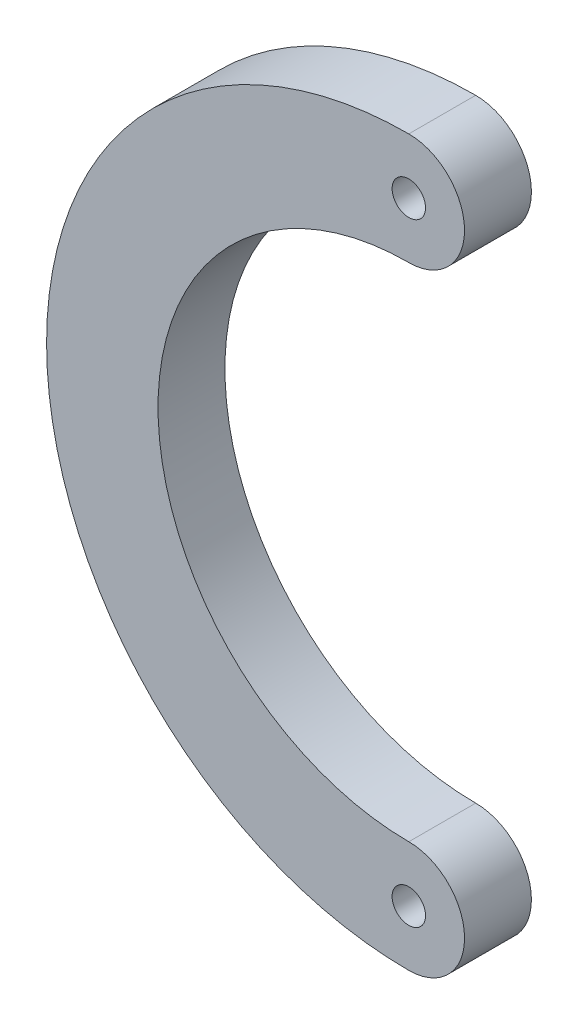
ISO-10303-21;
HEADER;
FILE_DESCRIPTION(('STEP AP214'),'2;1');
FILE_NAME('part.step','',(''),(''),'','','');
FILE_SCHEMA(('AUTOMOTIVE_DESIGN { 1 0 10303 214 1 1 1 1 }'));
ENDSEC;
DATA;
#1=APPLICATION_CONTEXT('core data for automotive mechanical design processes');
#2=APPLICATION_PROTOCOL_DEFINITION('international standard','automotive_design',2000,#1);
#3=PRODUCT_CONTEXT('',#1,'mechanical');
#4=PRODUCT('Part','Part','',(#3));
#5=PRODUCT_RELATED_PRODUCT_CATEGORY('part','',(#4));
#6=PRODUCT_DEFINITION_FORMATION('','',#4);
#7=PRODUCT_DEFINITION_CONTEXT('part definition',#1,'design');
#8=PRODUCT_DEFINITION('design','',#6,#7);
#9=PRODUCT_DEFINITION_SHAPE('','',#8);
#10=(LENGTH_UNIT() NAMED_UNIT(*) SI_UNIT(.MILLI.,.METRE.));
#11=(NAMED_UNIT(*) PLANE_ANGLE_UNIT() SI_UNIT($,.RADIAN.));
#12=(NAMED_UNIT(*) SI_UNIT($,.STERADIAN.) SOLID_ANGLE_UNIT());
#13=UNCERTAINTY_MEASURE_WITH_UNIT(LENGTH_MEASURE(1.E-05),#10,'distance_accuracy_value','');
#14=(GEOMETRIC_REPRESENTATION_CONTEXT(3) GLOBAL_UNCERTAINTY_ASSIGNED_CONTEXT((#13)) GLOBAL_UNIT_ASSIGNED_CONTEXT((#10,
#11,#12)) REPRESENTATION_CONTEXT('',''));
#15=CARTESIAN_POINT('',(0.,0.,0.));
#16=DIRECTION('',(0.,0.,1.));
#17=DIRECTION('',(1.,0.,0.));
#18=AXIS2_PLACEMENT_3D('',#15,#16,#17);
#19=CARTESIAN_POINT('',(0.,-27.5,6.));
#20=DIRECTION('',(0.,0.,-1.));
#21=DIRECTION('',(-1.,0.,0.));
#22=AXIS2_PLACEMENT_3D('',#19,#20,#21);
#23=CYLINDRICAL_SURFACE('',#22,5.);
#24=CARTESIAN_POINT('',(0.,-27.5,0.));
#25=DIRECTION('',(0.,0.,1.));
#26=DIRECTION('',(1.,0.,0.));
#27=AXIS2_PLACEMENT_3D('',#24,#25,#26);
#28=CIRCLE('',#27,5.);
#29=CARTESIAN_POINT('',(0.,-32.5,0.));
#30=VERTEX_POINT('',#29);
#31=CARTESIAN_POINT('',(0.,-22.5,0.));
#32=VERTEX_POINT('',#31);
#33=EDGE_CURVE('E107',#30,#32,#28,.T.);
#34=ORIENTED_EDGE('',*,*,#33,.T.);
#35=DIRECTION('',(0.,0.,-1.));
#36=VECTOR('',#35,1.);
#37=CARTESIAN_POINT('',(0.,-22.5,6.));
#38=LINE('',#37,#36);
#39=CARTESIAN_POINT('',(0.,-22.5,6.));
#40=VERTEX_POINT('',#39);
#41=EDGE_CURVE('E11',#40,#32,#38,.T.);
#42=ORIENTED_EDGE('',*,*,#41,.F.);
#43=CARTESIAN_POINT('',(0.,-27.5,6.));
#44=DIRECTION('',(0.,0.,1.));
#45=DIRECTION('',(1.,0.,0.));
#46=AXIS2_PLACEMENT_3D('',#43,#44,#45);
#47=CIRCLE('',#46,5.);
#48=CARTESIAN_POINT('',(0.,-32.5,6.));
#49=VERTEX_POINT('',#48);
#50=EDGE_CURVE('E91',#49,#40,#47,.T.);
#51=ORIENTED_EDGE('',*,*,#50,.F.);
#52=DIRECTION('',(0.,0.,-1.));
#53=VECTOR('',#52,1.);
#54=CARTESIAN_POINT('',(0.,-32.5,6.));
#55=LINE('',#54,#53);
#56=EDGE_CURVE('E103',#49,#30,#55,.T.);
#57=ORIENTED_EDGE('',*,*,#56,.T.);
#58=EDGE_LOOP('',(#34,#42,#51,#57));
#59=FACE_BOUND('',#58,.T.);
#60=ADVANCED_FACE('F39',(#59),#23,.T.);
#61=CARTESIAN_POINT('',(0.,0.,6.));
#62=DIRECTION('',(0.,0.,-1.));
#63=DIRECTION('',(-1.,0.,0.));
#64=AXIS2_PLACEMENT_3D('',#61,#62,#63);
#65=CYLINDRICAL_SURFACE('',#64,22.5);
#66=CARTESIAN_POINT('',(0.,0.,0.));
#67=DIRECTION('',(0.,0.,-1.));
#68=DIRECTION('',(1.,0.,0.));
#69=AXIS2_PLACEMENT_3D('',#66,#67,#68);
#70=CIRCLE('',#69,22.5);
#71=CARTESIAN_POINT('',(0.,22.5,0.));
#72=VERTEX_POINT('',#71);
#73=EDGE_CURVE('E96',#32,#72,#70,.T.);
#74=ORIENTED_EDGE('',*,*,#73,.T.);
#75=DIRECTION('',(0.,0.,-1.));
#76=VECTOR('',#75,1.);
#77=CARTESIAN_POINT('',(0.,22.5,6.));
#78=LINE('',#77,#76);
#79=CARTESIAN_POINT('',(0.,22.5,6.));
#80=VERTEX_POINT('',#79);
#81=EDGE_CURVE('E48',#80,#72,#78,.T.);
#82=ORIENTED_EDGE('',*,*,#81,.F.);
#83=CARTESIAN_POINT('',(0.,0.,6.));
#84=DIRECTION('',(0.,0.,-1.));
#85=DIRECTION('',(1.,0.,0.));
#86=AXIS2_PLACEMENT_3D('',#83,#84,#85);
#87=CIRCLE('',#86,22.5);
#88=EDGE_CURVE('E86',#40,#80,#87,.T.);
#89=ORIENTED_EDGE('',*,*,#88,.F.);
#90=ORIENTED_EDGE('',*,*,#41,.T.);
#91=EDGE_LOOP('',(#74,#82,#89,#90));
#92=FACE_BOUND('',#91,.T.);
#93=ADVANCED_FACE('F95',(#92),#65,.F.);
#94=CARTESIAN_POINT('',(0.,27.5,6.));
#95=DIRECTION('',(0.,0.,-1.));
#96=DIRECTION('',(-1.,0.,0.));
#97=AXIS2_PLACEMENT_3D('',#94,#95,#96);
#98=CYLINDRICAL_SURFACE('',#97,5.);
#99=CARTESIAN_POINT('',(0.,27.5,0.));
#100=DIRECTION('',(0.,0.,1.));
#101=DIRECTION('',(1.,0.,0.));
#102=AXIS2_PLACEMENT_3D('',#99,#100,#101);
#103=CIRCLE('',#102,5.);
#104=CARTESIAN_POINT('',(0.,32.5,0.));
#105=VERTEX_POINT('',#104);
#106=EDGE_CURVE('E73',#72,#105,#103,.T.);
#107=ORIENTED_EDGE('',*,*,#106,.T.);
#108=DIRECTION('',(0.,0.,-1.));
#109=VECTOR('',#108,1.);
#110=CARTESIAN_POINT('',(0.,32.5,6.));
#111=LINE('',#110,#109);
#112=CARTESIAN_POINT('',(0.,32.5,6.));
#113=VERTEX_POINT('',#112);
#114=EDGE_CURVE('E98',#113,#105,#111,.T.);
#115=ORIENTED_EDGE('',*,*,#114,.F.);
#116=CARTESIAN_POINT('',(0.,27.5,6.));
#117=DIRECTION('',(0.,0.,1.));
#118=DIRECTION('',(1.,0.,0.));
#119=AXIS2_PLACEMENT_3D('',#116,#117,#118);
#120=CIRCLE('',#119,5.);
#121=EDGE_CURVE('E89',#80,#113,#120,.T.);
#122=ORIENTED_EDGE('',*,*,#121,.F.);
#123=ORIENTED_EDGE('',*,*,#81,.T.);
#124=EDGE_LOOP('',(#107,#115,#122,#123));
#125=FACE_BOUND('',#124,.T.);
#126=ADVANCED_FACE('F99',(#125),#98,.T.);
#127=CARTESIAN_POINT('',(0.,0.,6.));
#128=DIRECTION('',(0.,0.,-1.));
#129=DIRECTION('',(-1.,0.,0.));
#130=AXIS2_PLACEMENT_3D('',#127,#128,#129);
#131=CYLINDRICAL_SURFACE('',#130,32.5);
#132=CARTESIAN_POINT('',(0.,0.,0.));
#133=DIRECTION('',(0.,0.,1.));
#134=DIRECTION('',(1.,0.,0.));
#135=AXIS2_PLACEMENT_3D('',#132,#133,#134);
#136=CIRCLE('',#135,32.5);
#137=EDGE_CURVE('E79',#105,#30,#136,.T.);
#138=ORIENTED_EDGE('',*,*,#137,.T.);
#139=ORIENTED_EDGE('',*,*,#56,.F.);
#140=CARTESIAN_POINT('',(0.,0.,6.));
#141=DIRECTION('',(0.,0.,1.));
#142=DIRECTION('',(1.,0.,0.));
#143=AXIS2_PLACEMENT_3D('',#140,#141,#142);
#144=CIRCLE('',#143,32.5);
#145=EDGE_CURVE('E56',#113,#49,#144,.T.);
#146=ORIENTED_EDGE('',*,*,#145,.F.);
#147=ORIENTED_EDGE('',*,*,#114,.T.);
#148=EDGE_LOOP('',(#138,#139,#146,#147));
#149=FACE_BOUND('',#148,.T.);
#150=ADVANCED_FACE('F121',(#149),#131,.T.);
#151=CARTESIAN_POINT('',(0.,-13.75,6.));
#152=DIRECTION('',(0.,0.,1.));
#153=DIRECTION('',(1.,0.,0.));
#154=AXIS2_PLACEMENT_3D('',#151,#152,#153);
#155=PLANE('',#154);
#156=CARTESIAN_POINT('',(0.,27.5,6.));
#157=DIRECTION('',(0.,0.,1.));
#158=DIRECTION('',(1.,0.,0.));
#159=AXIS2_PLACEMENT_3D('',#156,#157,#158);
#160=CIRCLE('',#159,1.5);
#161=CARTESIAN_POINT('',(1.5,27.5,6.));
#162=VERTEX_POINT('',#161);
#163=EDGE_CURVE('E139',#162,#162,#160,.T.);
#164=ORIENTED_EDGE('',*,*,#163,.F.);
#165=EDGE_LOOP('',(#164));
#166=FACE_BOUND('',#165,.T.);
#167=CARTESIAN_POINT('',(0.,-27.5,6.));
#168=DIRECTION('',(0.,0.,1.));
#169=DIRECTION('',(1.,0.,0.));
#170=AXIS2_PLACEMENT_3D('',#167,#168,#169);
#171=CIRCLE('',#170,1.5);
#172=CARTESIAN_POINT('',(1.5,-27.5,6.));
#173=VERTEX_POINT('',#172);
#174=EDGE_CURVE('E131',#173,#173,#171,.T.);
#175=ORIENTED_EDGE('',*,*,#174,.F.);
#176=EDGE_LOOP('',(#175));
#177=FACE_BOUND('',#176,.T.);
#178=ORIENTED_EDGE('',*,*,#50,.T.);
#179=ORIENTED_EDGE('',*,*,#88,.T.);
#180=ORIENTED_EDGE('',*,*,#121,.T.);
#181=ORIENTED_EDGE('',*,*,#145,.T.);
#182=EDGE_LOOP('',(#178,#179,#180,#181));
#183=FACE_BOUND('',#182,.T.);
#184=ADVANCED_FACE('F87',(#166,#177,#183),#155,.T.);
#185=CARTESIAN_POINT('',(0.,-13.75,0.));
#186=DIRECTION('',(0.,0.,1.));
#187=DIRECTION('',(1.,0.,0.));
#188=AXIS2_PLACEMENT_3D('',#185,#186,#187);
#189=PLANE('',#188);
#190=CARTESIAN_POINT('',(0.,27.5,0.));
#191=DIRECTION('',(0.,0.,1.));
#192=DIRECTION('',(1.,0.,0.));
#193=AXIS2_PLACEMENT_3D('',#190,#191,#192);
#194=CIRCLE('',#193,1.5);
#195=CARTESIAN_POINT('',(1.5,27.5,0.));
#196=VERTEX_POINT('',#195);
#197=EDGE_CURVE('E135',#196,#196,#194,.T.);
#198=ORIENTED_EDGE('',*,*,#197,.T.);
#199=EDGE_LOOP('',(#198));
#200=FACE_BOUND('',#199,.T.);
#201=CARTESIAN_POINT('',(0.,-27.5,0.));
#202=DIRECTION('',(0.,0.,1.));
#203=DIRECTION('',(1.,0.,0.));
#204=AXIS2_PLACEMENT_3D('',#201,#202,#203);
#205=CIRCLE('',#204,1.5);
#206=CARTESIAN_POINT('',(1.5,-27.5,0.));
#207=VERTEX_POINT('',#206);
#208=EDGE_CURVE('E111',#207,#207,#205,.T.);
#209=ORIENTED_EDGE('',*,*,#208,.T.);
#210=EDGE_LOOP('',(#209));
#211=FACE_BOUND('',#210,.T.);
#212=ORIENTED_EDGE('',*,*,#33,.F.);
#213=ORIENTED_EDGE('',*,*,#137,.F.);
#214=ORIENTED_EDGE('',*,*,#106,.F.);
#215=ORIENTED_EDGE('',*,*,#73,.F.);
#216=EDGE_LOOP('',(#212,#213,#214,#215));
#217=FACE_BOUND('',#216,.T.);
#218=ADVANCED_FACE('F124',(#200,#211,#217),#189,.F.);
#219=CARTESIAN_POINT('',(0.,-27.5,6.));
#220=DIRECTION('',(0.,0.,1.));
#221=DIRECTION('',(1.,0.,0.));
#222=AXIS2_PLACEMENT_3D('',#219,#220,#221);
#223=CYLINDRICAL_SURFACE('',#222,1.5);
#224=ORIENTED_EDGE('',*,*,#208,.F.);
#225=EDGE_LOOP('',(#224));
#226=FACE_BOUND('',#225,.T.);
#227=ORIENTED_EDGE('',*,*,#174,.T.);
#228=EDGE_LOOP('',(#227));
#229=FACE_BOUND('',#228,.T.);
#230=ADVANCED_FACE('F151',(#226,#229),#223,.F.);
#231=CARTESIAN_POINT('',(0.,27.5,6.));
#232=DIRECTION('',(0.,0.,1.));
#233=DIRECTION('',(1.,0.,0.));
#234=AXIS2_PLACEMENT_3D('',#231,#232,#233);
#235=CYLINDRICAL_SURFACE('',#234,1.5);
#236=ORIENTED_EDGE('',*,*,#197,.F.);
#237=EDGE_LOOP('',(#236));
#238=FACE_BOUND('',#237,.T.);
#239=ORIENTED_EDGE('',*,*,#163,.T.);
#240=EDGE_LOOP('',(#239));
#241=FACE_BOUND('',#240,.T.);
#242=ADVANCED_FACE('F144',(#238,#241),#235,.F.);
#243=CLOSED_SHELL('',(#60,#93,#126,#150,#184,#218,#230,#242));
#244=MANIFOLD_SOLID_BREP('B2',#243);
#245=ADVANCED_BREP_SHAPE_REPRESENTATION('',(#18,#244),#14);
#246=SHAPE_DEFINITION_REPRESENTATION(#9,#245);
ENDSEC;
END-ISO-10303-21;
